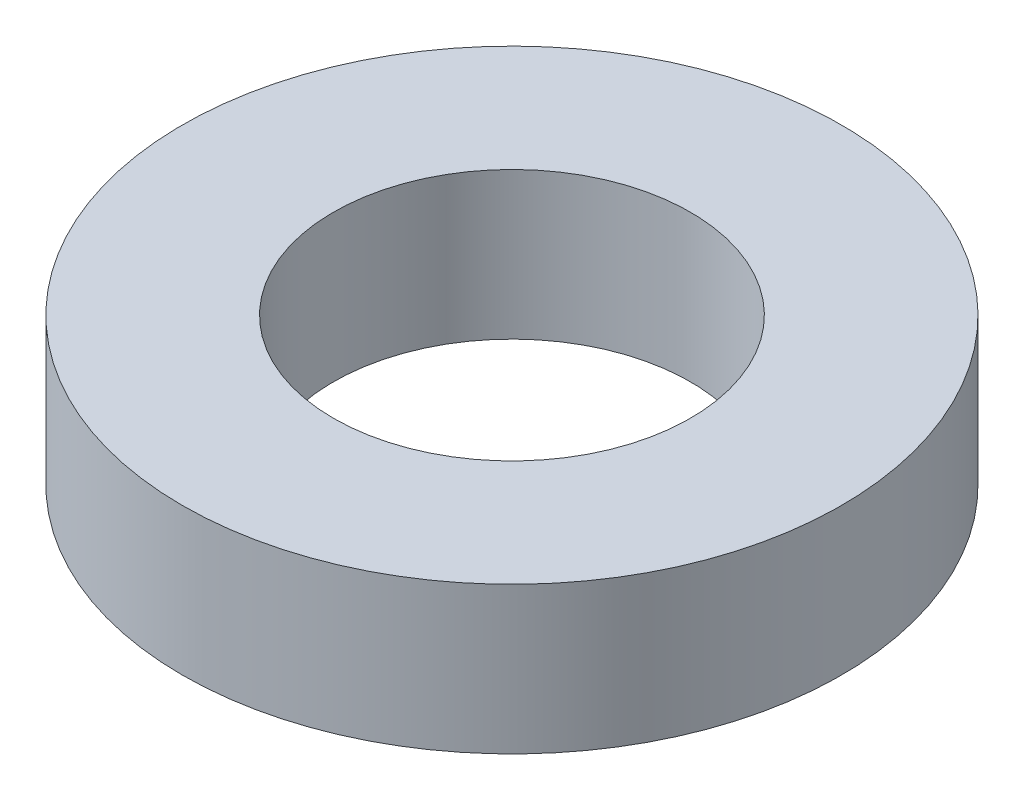
ISO-10303-21;
HEADER;
FILE_DESCRIPTION(('STEP AP214'),'2;1');
FILE_NAME('part.step','',(''),(''),'','','');
FILE_SCHEMA(('AUTOMOTIVE_DESIGN { 1 0 10303 214 1 1 1 1 }'));
ENDSEC;
DATA;
#1=APPLICATION_CONTEXT('core data for automotive mechanical design processes');
#2=APPLICATION_PROTOCOL_DEFINITION('international standard','automotive_design',2000,#1);
#3=PRODUCT_CONTEXT('',#1,'mechanical');
#4=PRODUCT('Part','Part','',(#3));
#5=PRODUCT_RELATED_PRODUCT_CATEGORY('part','',(#4));
#6=PRODUCT_DEFINITION_FORMATION('','',#4);
#7=PRODUCT_DEFINITION_CONTEXT('part definition',#1,'design');
#8=PRODUCT_DEFINITION('design','',#6,#7);
#9=PRODUCT_DEFINITION_SHAPE('','',#8);
#10=(LENGTH_UNIT() NAMED_UNIT(*) SI_UNIT(.MILLI.,.METRE.));
#11=(NAMED_UNIT(*) PLANE_ANGLE_UNIT() SI_UNIT($,.RADIAN.));
#12=(NAMED_UNIT(*) SI_UNIT($,.STERADIAN.) SOLID_ANGLE_UNIT());
#13=UNCERTAINTY_MEASURE_WITH_UNIT(LENGTH_MEASURE(1.E-05),#10,'distance_accuracy_value','');
#14=(GEOMETRIC_REPRESENTATION_CONTEXT(3) GLOBAL_UNCERTAINTY_ASSIGNED_CONTEXT((#13)) GLOBAL_UNIT_ASSIGNED_CONTEXT((#10,
#11,#12)) REPRESENTATION_CONTEXT('',''));
#15=CARTESIAN_POINT('',(0.,0.,0.));
#16=DIRECTION('',(0.,0.,1.));
#17=DIRECTION('',(1.,0.,0.));
#18=AXIS2_PLACEMENT_3D('',#15,#16,#17);
#19=CARTESIAN_POINT('',(0.,1.3375,0.));
#20=DIRECTION('',(0.,1.,0.));
#21=DIRECTION('',(0.,0.,1.));
#22=AXIS2_PLACEMENT_3D('',#19,#20,#21);
#23=PLANE('',#22);
#24=CARTESIAN_POINT('',(0.,1.3375,0.));
#25=DIRECTION('',(0.,1.,0.));
#26=DIRECTION('',(0.,0.,1.));
#27=AXIS2_PLACEMENT_3D('',#24,#25,#26);
#28=CIRCLE('',#27,6.);
#29=CARTESIAN_POINT('',(0.,1.3375,6.));
#30=VERTEX_POINT('',#29);
#31=EDGE_CURVE('E10',#30,#30,#28,.T.);
#32=ORIENTED_EDGE('',*,*,#31,.T.);
#33=EDGE_LOOP('',(#32));
#34=FACE_BOUND('',#33,.T.);
#35=CARTESIAN_POINT('',(0.,1.3375,0.));
#36=DIRECTION('',(0.,1.,0.));
#37=DIRECTION('',(0.,0.,1.));
#38=AXIS2_PLACEMENT_3D('',#35,#36,#37);
#39=CIRCLE('',#38,3.25);
#40=CARTESIAN_POINT('',(0.,1.3375,3.25));
#41=VERTEX_POINT('',#40);
#42=EDGE_CURVE('E48',#41,#41,#39,.T.);
#43=ORIENTED_EDGE('',*,*,#42,.F.);
#44=EDGE_LOOP('',(#43));
#45=FACE_BOUND('',#44,.T.);
#46=ADVANCED_FACE('F37',(#34,#45),#23,.T.);
#47=CARTESIAN_POINT('',(0.,-1.3375,0.));
#48=DIRECTION('',(0.,1.,0.));
#49=DIRECTION('',(0.,0.,1.));
#50=AXIS2_PLACEMENT_3D('',#47,#48,#49);
#51=PLANE('',#50);
#52=CARTESIAN_POINT('',(0.,-1.3375,0.));
#53=DIRECTION('',(0.,1.,0.));
#54=DIRECTION('',(0.,0.,1.));
#55=AXIS2_PLACEMENT_3D('',#52,#53,#54);
#56=CIRCLE('',#55,6.);
#57=CARTESIAN_POINT('',(0.,-1.3375,6.));
#58=VERTEX_POINT('',#57);
#59=EDGE_CURVE('E41',#58,#58,#56,.T.);
#60=ORIENTED_EDGE('',*,*,#59,.F.);
#61=EDGE_LOOP('',(#60));
#62=FACE_BOUND('',#61,.T.);
#63=CARTESIAN_POINT('',(0.,-1.3375,0.));
#64=DIRECTION('',(0.,1.,0.));
#65=DIRECTION('',(0.,0.,1.));
#66=AXIS2_PLACEMENT_3D('',#63,#64,#65);
#67=CIRCLE('',#66,3.25);
#68=CARTESIAN_POINT('',(0.,-1.3375,3.25));
#69=VERTEX_POINT('',#68);
#70=EDGE_CURVE('E50',#69,#69,#67,.T.);
#71=ORIENTED_EDGE('',*,*,#70,.T.);
#72=EDGE_LOOP('',(#71));
#73=FACE_BOUND('',#72,.T.);
#74=ADVANCED_FACE('F60',(#62,#73),#51,.F.);
#75=CARTESIAN_POINT('',(0.,1.3375,0.));
#76=DIRECTION('',(0.,-1.,0.));
#77=DIRECTION('',(0.,0.,-1.));
#78=AXIS2_PLACEMENT_3D('',#75,#76,#77);
#79=CYLINDRICAL_SURFACE('',#78,6.);
#80=ORIENTED_EDGE('',*,*,#31,.F.);
#81=EDGE_LOOP('',(#80));
#82=FACE_BOUND('',#81,.T.);
#83=ORIENTED_EDGE('',*,*,#59,.T.);
#84=EDGE_LOOP('',(#83));
#85=FACE_BOUND('',#84,.T.);
#86=ADVANCED_FACE('F39',(#82,#85),#79,.T.);
#87=CARTESIAN_POINT('',(0.,1.3375,0.));
#88=DIRECTION('',(0.,-1.,0.));
#89=DIRECTION('',(0.,0.,-1.));
#90=AXIS2_PLACEMENT_3D('',#87,#88,#89);
#91=CYLINDRICAL_SURFACE('',#90,3.25);
#92=ORIENTED_EDGE('',*,*,#42,.T.);
#93=EDGE_LOOP('',(#92));
#94=FACE_BOUND('',#93,.T.);
#95=ORIENTED_EDGE('',*,*,#70,.F.);
#96=EDGE_LOOP('',(#95));
#97=FACE_BOUND('',#96,.T.);
#98=ADVANCED_FACE('F56',(#94,#97),#91,.F.);
#99=CLOSED_SHELL('',(#46,#74,#86,#98));
#100=MANIFOLD_SOLID_BREP('B2',#99);
#101=ADVANCED_BREP_SHAPE_REPRESENTATION('',(#18,#100),#14);
#102=SHAPE_DEFINITION_REPRESENTATION(#9,#101);
ENDSEC;
END-ISO-10303-21;
